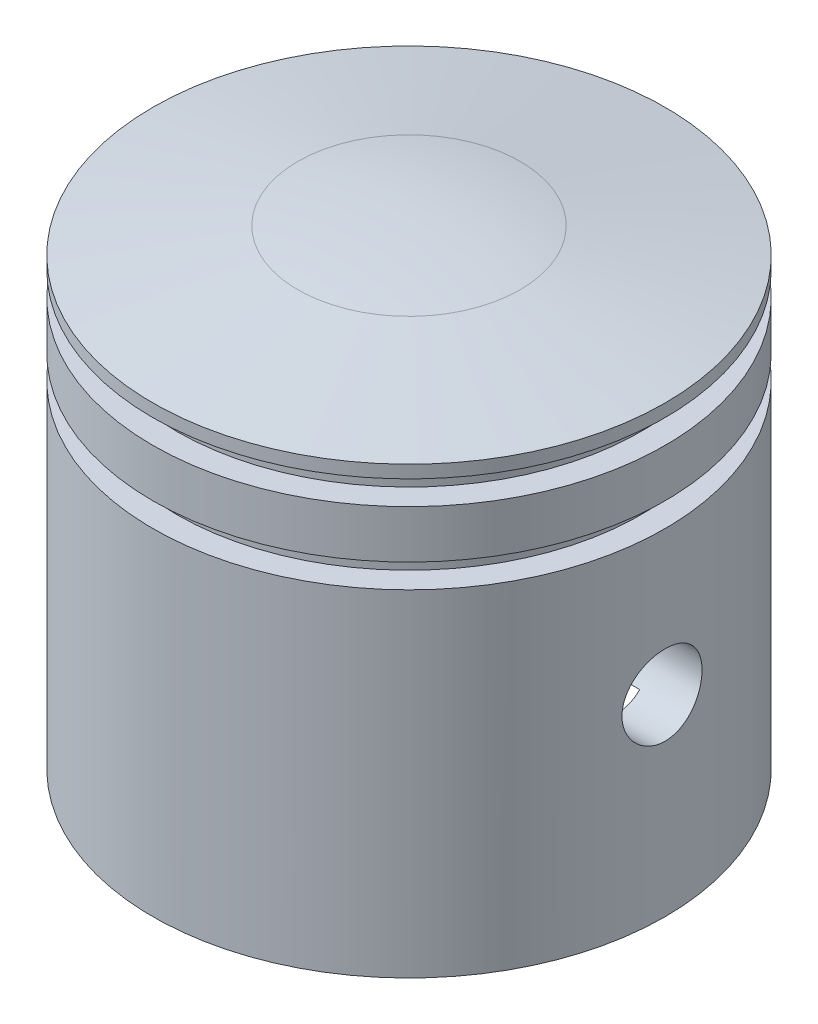
ISO-10303-21;
HEADER;
FILE_DESCRIPTION(('STEP AP214'),'2;1');
FILE_NAME('part.step','',(''),(''),'','','');
FILE_SCHEMA(('AUTOMOTIVE_DESIGN { 1 0 10303 214 1 1 1 1 }'));
ENDSEC;
DATA;
#1=APPLICATION_CONTEXT('core data for automotive mechanical design processes');
#2=APPLICATION_PROTOCOL_DEFINITION('international standard','automotive_design',2000,#1);
#3=PRODUCT_CONTEXT('',#1,'mechanical');
#4=PRODUCT('Part','Part','',(#3));
#5=PRODUCT_RELATED_PRODUCT_CATEGORY('part','',(#4));
#6=PRODUCT_DEFINITION_FORMATION('','',#4);
#7=PRODUCT_DEFINITION_CONTEXT('part definition',#1,'design');
#8=PRODUCT_DEFINITION('design','',#6,#7);
#9=PRODUCT_DEFINITION_SHAPE('','',#8);
#10=(LENGTH_UNIT() NAMED_UNIT(*) SI_UNIT(.MILLI.,.METRE.));
#11=(NAMED_UNIT(*) PLANE_ANGLE_UNIT() SI_UNIT($,.RADIAN.));
#12=(NAMED_UNIT(*) SI_UNIT($,.STERADIAN.) SOLID_ANGLE_UNIT());
#13=UNCERTAINTY_MEASURE_WITH_UNIT(LENGTH_MEASURE(1.E-05),#10,'distance_accuracy_value','');
#14=(GEOMETRIC_REPRESENTATION_CONTEXT(3) GLOBAL_UNCERTAINTY_ASSIGNED_CONTEXT((#13)) GLOBAL_UNIT_ASSIGNED_CONTEXT((#10,
#11,#12)) REPRESENTATION_CONTEXT('',''));
#15=CARTESIAN_POINT('',(0.,0.,0.));
#16=DIRECTION('',(0.,0.,1.));
#17=DIRECTION('',(1.,0.,0.));
#18=AXIS2_PLACEMENT_3D('',#15,#16,#17);
#19=CARTESIAN_POINT('',(0.,10.,0.));
#20=DIRECTION('',(0.,-1.,0.));
#21=DIRECTION('',(1.,0.,0.));
#22=AXIS2_PLACEMENT_3D('',#19,#20,#21);
#23=PLANE('',#22);
#24=DIRECTION('',(1.,0.,0.));
#25=VECTOR('',#24,1.);
#26=CARTESIAN_POINT('',(-16.,10.,-1.5));
#27=LINE('',#26,#25);
#28=CARTESIAN_POINT('',(-12.913171570145,10.,-1.5));
#29=VERTEX_POINT('',#28);
#30=CARTESIAN_POINT('',(-9.88685996664259,10.,-1.5));
#31=VERTEX_POINT('',#30);
#32=EDGE_CURVE('E74',#29,#31,#27,.T.);
#33=ORIENTED_EDGE('',*,*,#32,.F.);
#34=CARTESIAN_POINT('',(0.,10.,0.));
#35=DIRECTION('',(0.,-1.,0.));
#36=DIRECTION('',(1.,0.,0.));
#37=AXIS2_PLACEMENT_3D('',#34,#35,#36);
#38=CIRCLE('',#37,13.);
#39=CARTESIAN_POINT('',(12.913171570145,10.,-1.5));
#40=VERTEX_POINT('',#39);
#41=EDGE_CURVE('E116',#29,#40,#38,.T.);
#42=ORIENTED_EDGE('',*,*,#41,.T.);
#43=CARTESIAN_POINT('',(9.88685996664259,10.,-1.5));
#44=VERTEX_POINT('',#43);
#45=EDGE_CURVE('E289',#44,#40,#27,.T.);
#46=ORIENTED_EDGE('',*,*,#45,.F.);
#47=CARTESIAN_POINT('',(0.,10.,0.));
#48=DIRECTION('',(0.,-1.,0.));
#49=DIRECTION('',(1.,0.,0.));
#50=AXIS2_PLACEMENT_3D('',#47,#48,#49);
#51=CIRCLE('',#50,10.);
#52=EDGE_CURVE('E111',#44,#31,#51,.F.);
#53=ORIENTED_EDGE('',*,*,#52,.T.);
#54=EDGE_LOOP('',(#33,#42,#46,#53));
#55=FACE_BOUND('',#54,.T.);
#56=ADVANCED_FACE('F45',(#55),#23,.T.);
#57=CARTESIAN_POINT('',(0.,30.,0.));
#58=DIRECTION('',(0.,1.,0.));
#59=DIRECTION('',(-1.,0.,0.));
#60=AXIS2_PLACEMENT_3D('',#57,#58,#59);
#61=CYLINDRICAL_SURFACE('',#60,16.);
#62=CARTESIAN_POINT('',(0.,27.,0.));
#63=DIRECTION('',(0.,1.,0.));
#64=DIRECTION('',(0.,0.,1.));
#65=AXIS2_PLACEMENT_3D('',#62,#63,#64);
#66=CIRCLE('',#65,16.);
#67=CARTESIAN_POINT('',(0.,27.,16.));
#68=VERTEX_POINT('',#67);
#69=EDGE_CURVE('E243',#68,#68,#66,.T.);
#70=ORIENTED_EDGE('',*,*,#69,.T.);
#71=EDGE_LOOP('',(#70));
#72=FACE_BOUND('',#71,.T.);
#73=CARTESIAN_POINT('',(0.,27.7958327840944,0.));
#74=DIRECTION('',(0.,1.,0.));
#75=DIRECTION('',(-1.,0.,0.));
#76=AXIS2_PLACEMENT_3D('',#73,#74,#75);
#77=CIRCLE('',#76,16.);
#78=CARTESIAN_POINT('',(-16.,27.7958327840944,0.));
#79=VERTEX_POINT('',#78);
#80=EDGE_CURVE('E257',#79,#79,#77,.T.);
#81=ORIENTED_EDGE('',*,*,#80,.F.);
#82=EDGE_LOOP('',(#81));
#83=FACE_BOUND('',#82,.T.);
#84=ADVANCED_FACE('F163',(#72,#83),#61,.T.);
#85=CARTESIAN_POINT('',(0.,27.7958327840944,0.));
#86=DIRECTION('',(0.,-1.,0.));
#87=DIRECTION('',(1.,0.,0.));
#88=AXIS2_PLACEMENT_3D('',#85,#86,#87);
#89=CONICAL_SURFACE('',#88,16.,1.39626340159547);
#90=CARTESIAN_POINT('',(0.,29.3923101204884,0.));
#91=DIRECTION('',(0.,1.,0.));
#92=DIRECTION('',(-1.,0.,0.));
#93=AXIS2_PLACEMENT_3D('',#90,#91,#92);
#94=CIRCLE('',#93,6.94592710667694);
#95=CARTESIAN_POINT('',(-6.94592710667694,29.3923101204884,0.));
#96=VERTEX_POINT('',#95);
#97=EDGE_CURVE('E254',#96,#96,#94,.T.);
#98=ORIENTED_EDGE('',*,*,#97,.F.);
#99=EDGE_LOOP('',(#98));
#100=FACE_BOUND('',#99,.T.);
#101=ORIENTED_EDGE('',*,*,#80,.T.);
#102=EDGE_LOOP('',(#101));
#103=FACE_BOUND('',#102,.T.);
#104=ADVANCED_FACE('F167',(#100,#103),#89,.T.);
#105=CARTESIAN_POINT('',(0.,-9.99999999999999,0.));
#106=DIRECTION('',(0.,1.,0.));
#107=DIRECTION('',(1.,0.,0.));
#108=AXIS2_PLACEMENT_3D('',#105,#106,#107);
#109=SPHERICAL_SURFACE('',#108,40.);
#110=ORIENTED_EDGE('',*,*,#97,.T.);
#111=EDGE_LOOP('',(#110));
#112=FACE_BOUND('',#111,.T.);
#113=ADVANCED_FACE('F174',(#112),#109,.T.);
#114=CARTESIAN_POINT('',(14.5,25.5,0.));
#115=DIRECTION('',(0.,-1.,0.));
#116=DIRECTION('',(0.,0.,-1.));
#117=AXIS2_PLACEMENT_3D('',#114,#115,#116);
#118=PLANE('',#117);
#119=CARTESIAN_POINT('',(0.,25.5,0.));
#120=DIRECTION('',(0.,-1.,0.));
#121=DIRECTION('',(0.,0.,-1.));
#122=AXIS2_PLACEMENT_3D('',#119,#120,#121);
#123=CIRCLE('',#122,14.5);
#124=CARTESIAN_POINT('',(0.,25.5,-14.5));
#125=VERTEX_POINT('',#124);
#126=EDGE_CURVE('E238',#125,#125,#123,.T.);
#127=ORIENTED_EDGE('',*,*,#126,.T.);
#128=EDGE_LOOP('',(#127));
#129=FACE_BOUND('',#128,.T.);
#130=CARTESIAN_POINT('',(0.,25.5,0.));
#131=DIRECTION('',(0.,-1.,0.));
#132=DIRECTION('',(0.,0.,-1.));
#133=AXIS2_PLACEMENT_3D('',#130,#131,#132);
#134=CIRCLE('',#133,16.);
#135=CARTESIAN_POINT('',(0.,25.5,-16.));
#136=VERTEX_POINT('',#135);
#137=EDGE_CURVE('E119',#136,#136,#134,.T.);
#138=ORIENTED_EDGE('',*,*,#137,.F.);
#139=EDGE_LOOP('',(#138));
#140=FACE_BOUND('',#139,.T.);
#141=ADVANCED_FACE('F178',(#129,#140),#118,.F.);
#142=CARTESIAN_POINT('',(14.5,27.,0.));
#143=DIRECTION('',(0.,1.,0.));
#144=DIRECTION('',(0.,0.,1.));
#145=AXIS2_PLACEMENT_3D('',#142,#143,#144);
#146=PLANE('',#145);
#147=CARTESIAN_POINT('',(0.,27.,0.));
#148=DIRECTION('',(0.,-1.,0.));
#149=DIRECTION('',(0.,0.,-1.));
#150=AXIS2_PLACEMENT_3D('',#147,#148,#149);
#151=CIRCLE('',#150,14.5);
#152=CARTESIAN_POINT('',(0.,27.,-14.5));
#153=VERTEX_POINT('',#152);
#154=EDGE_CURVE('E246',#153,#153,#151,.T.);
#155=ORIENTED_EDGE('',*,*,#154,.F.);
#156=EDGE_LOOP('',(#155));
#157=FACE_BOUND('',#156,.T.);
#158=ORIENTED_EDGE('',*,*,#69,.F.);
#159=EDGE_LOOP('',(#158));
#160=FACE_BOUND('',#159,.T.);
#161=ADVANCED_FACE('F195',(#157,#160),#146,.F.);
#162=CARTESIAN_POINT('',(0.,0.,0.));
#163=DIRECTION('',(0.,-1.,0.));
#164=DIRECTION('',(0.,0.,-1.));
#165=AXIS2_PLACEMENT_3D('',#162,#163,#164);
#166=CYLINDRICAL_SURFACE('',#165,14.5);
#167=ORIENTED_EDGE('',*,*,#126,.F.);
#168=EDGE_LOOP('',(#167));
#169=FACE_BOUND('',#168,.T.);
#170=ORIENTED_EDGE('',*,*,#154,.T.);
#171=EDGE_LOOP('',(#170));
#172=FACE_BOUND('',#171,.T.);
#173=ADVANCED_FACE('F192',(#169,#172),#166,.T.);
#174=ORIENTED_EDGE('',*,*,#137,.T.);
#175=EDGE_LOOP('',(#174));
#176=FACE_BOUND('',#175,.T.);
#177=CARTESIAN_POINT('',(0.,22.5,0.));
#178=DIRECTION('',(0.,1.,0.));
#179=DIRECTION('',(0.,0.,1.));
#180=AXIS2_PLACEMENT_3D('',#177,#178,#179);
#181=CIRCLE('',#180,16.);
#182=CARTESIAN_POINT('',(0.,22.5,16.));
#183=VERTEX_POINT('',#182);
#184=EDGE_CURVE('E234',#183,#183,#181,.T.);
#185=ORIENTED_EDGE('',*,*,#184,.T.);
#186=EDGE_LOOP('',(#185));
#187=FACE_BOUND('',#186,.T.);
#188=ADVANCED_FACE('F169',(#176,#187),#61,.T.);
#189=CARTESIAN_POINT('',(14.5,21.,0.));
#190=DIRECTION('',(0.,-1.,0.));
#191=DIRECTION('',(0.,0.,-1.));
#192=AXIS2_PLACEMENT_3D('',#189,#190,#191);
#193=PLANE('',#192);
#194=CARTESIAN_POINT('',(0.,21.,0.));
#195=DIRECTION('',(0.,-1.,0.));
#196=DIRECTION('',(0.,0.,-1.));
#197=AXIS2_PLACEMENT_3D('',#194,#195,#196);
#198=CIRCLE('',#197,14.5);
#199=CARTESIAN_POINT('',(0.,21.,-14.5));
#200=VERTEX_POINT('',#199);
#201=EDGE_CURVE('E263',#200,#200,#198,.T.);
#202=ORIENTED_EDGE('',*,*,#201,.T.);
#203=EDGE_LOOP('',(#202));
#204=FACE_BOUND('',#203,.T.);
#205=CARTESIAN_POINT('',(0.,21.,0.));
#206=DIRECTION('',(0.,-1.,0.));
#207=DIRECTION('',(0.,0.,-1.));
#208=AXIS2_PLACEMENT_3D('',#205,#206,#207);
#209=CIRCLE('',#208,16.);
#210=CARTESIAN_POINT('',(0.,21.,-16.));
#211=VERTEX_POINT('',#210);
#212=EDGE_CURVE('E237',#211,#211,#209,.T.);
#213=ORIENTED_EDGE('',*,*,#212,.F.);
#214=EDGE_LOOP('',(#213));
#215=FACE_BOUND('',#214,.T.);
#216=ADVANCED_FACE('F185',(#204,#215),#193,.F.);
#217=CARTESIAN_POINT('',(14.5,22.5,0.));
#218=DIRECTION('',(0.,1.,0.));
#219=DIRECTION('',(0.,0.,1.));
#220=AXIS2_PLACEMENT_3D('',#217,#218,#219);
#221=PLANE('',#220);
#222=CARTESIAN_POINT('',(0.,22.5,0.));
#223=DIRECTION('',(0.,-1.,0.));
#224=DIRECTION('',(0.,0.,-1.));
#225=AXIS2_PLACEMENT_3D('',#222,#223,#224);
#226=CIRCLE('',#225,14.5);
#227=CARTESIAN_POINT('',(0.,22.5,-14.5));
#228=VERTEX_POINT('',#227);
#229=EDGE_CURVE('E267',#228,#228,#226,.T.);
#230=ORIENTED_EDGE('',*,*,#229,.F.);
#231=EDGE_LOOP('',(#230));
#232=FACE_BOUND('',#231,.T.);
#233=ORIENTED_EDGE('',*,*,#184,.F.);
#234=EDGE_LOOP('',(#233));
#235=FACE_BOUND('',#234,.T.);
#236=ADVANCED_FACE('F183',(#232,#235),#221,.F.);
#237=CARTESIAN_POINT('',(0.,0.,0.));
#238=DIRECTION('',(0.,-1.,0.));
#239=DIRECTION('',(0.,0.,-1.));
#240=AXIS2_PLACEMENT_3D('',#237,#238,#239);
#241=CYLINDRICAL_SURFACE('',#240,14.5);
#242=ORIENTED_EDGE('',*,*,#201,.F.);
#243=EDGE_LOOP('',(#242));
#244=FACE_BOUND('',#243,.T.);
#245=ORIENTED_EDGE('',*,*,#229,.T.);
#246=EDGE_LOOP('',(#245));
#247=FACE_BOUND('',#246,.T.);
#248=ADVANCED_FACE('F180',(#244,#247),#241,.T.);
#249=CARTESIAN_POINT('',(0.,0.,0.));
#250=DIRECTION('',(0.,1.,0.));
#251=DIRECTION('',(-1.,0.,0.));
#252=AXIS2_PLACEMENT_3D('',#249,#250,#251);
#253=PLANE('',#252);
#254=CARTESIAN_POINT('',(0.,0.,0.));
#255=DIRECTION('',(0.,-1.,0.));
#256=DIRECTION('',(1.,0.,0.));
#257=AXIS2_PLACEMENT_3D('',#254,#255,#256);
#258=CIRCLE('',#257,13.);
#259=CARTESIAN_POINT('',(13.,0.,0.));
#260=VERTEX_POINT('',#259);
#261=EDGE_CURVE('E277',#260,#260,#258,.T.);
#262=ORIENTED_EDGE('',*,*,#261,.F.);
#263=EDGE_LOOP('',(#262));
#264=FACE_BOUND('',#263,.T.);
#265=CARTESIAN_POINT('',(0.,0.,0.));
#266=DIRECTION('',(0.,1.,0.));
#267=DIRECTION('',(-1.,0.,0.));
#268=AXIS2_PLACEMENT_3D('',#265,#266,#267);
#269=CIRCLE('',#268,16.);
#270=CARTESIAN_POINT('',(-16.,0.,0.));
#271=VERTEX_POINT('',#270);
#272=EDGE_CURVE('E99',#271,#271,#269,.T.);
#273=ORIENTED_EDGE('',*,*,#272,.F.);
#274=EDGE_LOOP('',(#273));
#275=FACE_BOUND('',#274,.T.);
#276=ADVANCED_FACE('F47',(#264,#275),#253,.F.);
#277=CARTESIAN_POINT('',(-16.,9.5,0.));
#278=CARTESIAN_POINT('',(-15.9999977019448,9.50000569827152,-0.139515097271033));
#279=CARTESIAN_POINT('',(-15.9981561248574,9.51171811377356,-0.279109404865704));
#280=CARTESIAN_POINT('',(-15.9909869809759,9.55824369127675,-0.554391314978102));
#281=CARTESIAN_POINT('',(-15.9856560884472,9.59307889250351,-0.690075061323317));
#282=CARTESIAN_POINT('',(-15.9721069716578,9.68477966280662,-0.953512538047404));
#283=CARTESIAN_POINT('',(-15.9638909956317,9.7416280813616,-1.0812723522899));
#284=CARTESIAN_POINT('',(-15.9454779403816,9.87569854514161,-1.3254212510446));
#285=CARTESIAN_POINT('',(-15.9352811186255,9.95291794303594,-1.44181181036831));
#286=CARTESIAN_POINT('',(-15.9139426841436,10.126233048354,-1.66091991165162));
#287=CARTESIAN_POINT('',(-15.9027945139234,10.2224669948902,-1.76352747914264));
#288=CARTESIAN_POINT('',(-15.8808607613029,10.4307819482689,-1.95120768822823));
#289=CARTESIAN_POINT('',(-15.8700752005075,10.5428638973002,-2.03627928654192));
#290=CARTESIAN_POINT('',(-15.8500242812745,10.7804382713437,-2.18690544328884));
#291=CARTESIAN_POINT('',(-15.840767397861,10.9059994823618,-2.25235273557992));
#292=CARTESIAN_POINT('',(-15.8249120174237,11.1665014108578,-2.36118681597065));
#293=CARTESIAN_POINT('',(-15.8183133630222,11.3014415725106,-2.40457491010063));
#294=CARTESIAN_POINT('',(-15.8085863451104,11.5757109011438,-2.46771559322167));
#295=CARTESIAN_POINT('',(-15.8054302653236,11.7149955858188,-2.48765705487496));
#296=CARTESIAN_POINT('',(-15.8028617107177,11.9949671888926,-2.50392369757622));
#297=CARTESIAN_POINT('',(-15.8034490028802,12.135654019466,-2.50025034860466));
#298=CARTESIAN_POINT('',(-15.8082755045521,12.4130970318527,-2.4695458080889));
#299=CARTESIAN_POINT('',(-15.8124817218495,12.5498772233531,-2.44272562959693));
#300=CARTESIAN_POINT('',(-15.8240205634547,12.8169720063593,-2.36681937833752));
#301=CARTESIAN_POINT('',(-15.8313532830641,12.9472864006405,-2.31773262684132));
#302=CARTESIAN_POINT('',(-15.8483550685462,13.1983887126772,-2.19846916949384));
#303=CARTESIAN_POINT('',(-15.8580339308724,13.3191337917731,-2.12820372315549));
#304=CARTESIAN_POINT('',(-15.878630461501,13.5471995356855,-1.96864058146637));
#305=CARTESIAN_POINT('',(-15.8895482178821,13.6545192448875,-1.87934153253017));
#306=CARTESIAN_POINT('',(-15.911537862489,13.8539102466333,-1.68309088822333));
#307=CARTESIAN_POINT('',(-15.9226101363559,13.9458031582695,-1.57595800560539));
#308=CARTESIAN_POINT('',(-15.9435512534783,14.1103331456399,-1.34769694737936));
#309=CARTESIAN_POINT('',(-15.9534200906202,14.1829701235568,-1.22656870068132));
#310=CARTESIAN_POINT('',(-15.9708539902704,14.3069380734224,-0.973595927056491));
#311=CARTESIAN_POINT('',(-15.9784174854193,14.358254558533,-0.84174418624046));
#312=CARTESIAN_POINT('',(-15.9903756000068,14.4379659674472,-0.571149534696759));
#313=CARTESIAN_POINT('',(-15.9947704520898,14.4663625740665,-0.4324071306872));
#314=CARTESIAN_POINT('',(-15.9998651172728,14.4991892764502,-0.153508336763735));
#315=CARTESIAN_POINT('',(-16.0006027179286,14.5038644789762,-0.0133814615087023));
#316=CARTESIAN_POINT('',(-15.9984028649127,14.489767294664,0.265654546411642));
#317=CARTESIAN_POINT('',(-15.9954655349964,14.4709956974109,0.404563719925156));
#318=CARTESIAN_POINT('',(-15.9862692369322,14.4107416123198,0.676473446265704));
#319=CARTESIAN_POINT('',(-15.9800278421539,14.3693792417323,0.809501262056042));
#320=CARTESIAN_POINT('',(-15.9649207568356,14.2652449056012,1.06673406785663));
#321=CARTESIAN_POINT('',(-15.9560549341007,14.2024718615573,1.19093861303941));
#322=CARTESIAN_POINT('',(-15.9365897274094,14.0567280088734,1.42807220225041));
#323=CARTESIAN_POINT('',(-15.9259772866342,13.9736025799095,1.54090512378372));
#324=CARTESIAN_POINT('',(-15.9042388046444,13.7897279140922,1.75110696507806));
#325=CARTESIAN_POINT('',(-15.8931127309268,13.6889775607952,1.84847490447018));
#326=CARTESIAN_POINT('',(-15.8714802753665,13.4716188027828,2.02588080776691));
#327=CARTESIAN_POINT('',(-15.860980411908,13.3548751528777,2.10575398584126));
#328=CARTESIAN_POINT('',(-15.8419069280583,13.1094839263387,2.2447556772664));
#329=CARTESIAN_POINT('',(-15.83333325222,12.9808366925105,2.30388478778105));
#330=CARTESIAN_POINT('',(-15.8191307135236,12.7157703592858,2.39946771944995));
#331=CARTESIAN_POINT('',(-15.8134908234896,12.5793825312344,2.43600654947912));
#332=CARTESIAN_POINT('',(-15.8057657028079,12.302310856336,2.48564122040535));
#333=CARTESIAN_POINT('',(-15.8036802038444,12.161627334581,2.49873883084997));
#334=CARTESIAN_POINT('',(-15.8033105804488,11.8816012840925,2.50107452690756));
#335=CARTESIAN_POINT('',(-15.804985160429,11.7422609030665,2.49057180548425));
#336=CARTESIAN_POINT('',(-15.8118569894183,11.4673547028557,2.44656223255901));
#337=CARTESIAN_POINT('',(-15.8170542307995,11.3317888754983,2.41305543086961));
#338=CARTESIAN_POINT('',(-15.8303708885491,11.0683621733595,2.32408329891852));
#339=CARTESIAN_POINT('',(-15.8384876895341,10.9404945217416,2.26863761738581));
#340=CARTESIAN_POINT('',(-15.856731840474,10.6958343863237,2.13738768546417));
#341=CARTESIAN_POINT('',(-15.8668592701083,10.5790423417116,2.06158262820886));
#342=CARTESIAN_POINT('',(-15.8881156809226,10.3585344558732,1.8908300813908));
#343=CARTESIAN_POINT('',(-15.8992540116029,10.2549678033862,1.79569107094768));
#344=CARTESIAN_POINT('',(-15.9212004364073,10.0651787636133,1.58937594638204));
#345=CARTESIAN_POINT('',(-15.9320084534012,9.97896040140812,1.47819612078433));
#346=CARTESIAN_POINT('',(-15.952151024567,9.82584877696844,1.24216685884342));
#347=CARTESIAN_POINT('',(-15.9614763443027,9.75907462724039,1.11723937214238));
#348=CARTESIAN_POINT('',(-15.9775125983888,9.64755900380706,0.857851882357786));
#349=CARTESIAN_POINT('',(-15.9842262014212,9.60279502744161,0.723401776581764));
#350=CARTESIAN_POINT('',(-15.9927744586488,9.54656697890941,0.490314239911595));
#351=CARTESIAN_POINT('',(-15.9954699162612,9.529131509371,0.393105575651625));
#352=CARTESIAN_POINT('',(-15.9990834869762,9.50584608662092,0.197277797850582));
#353=CARTESIAN_POINT('',(-16.0000016250796,9.49999597044266,0.0986587041691187));
#354=CARTESIAN_POINT('',(-16.,9.5,0.));
#355=B_SPLINE_CURVE_WITH_KNOTS('',3,(#277,#278,#279,#280,#281,#282,#283,#284,#285,#286,#287,
#288,#289,#290,#291,#292,#293,#294,#295,#296,#297,#298,#299,#300,#301,#302,#303,#304,#305,#306,
#307,#308,#309,#310,#311,#312,#313,#314,#315,#316,#317,#318,#319,#320,#321,#322,#323,#324,#325,
#326,#327,#328,#329,#330,#331,#332,#333,#334,#335,#336,#337,#338,#339,#340,#341,#342,#343,#344,
#345,#346,#347,#348,#349,#350,#351,#352,#353,#354),.UNSPECIFIED.,.T.,.F.,(4,2,2,2,2,2,2,2,2,2,2,
2,2,2,2,2,2,2,2,2,2,2,2,2,2,2,2,2,2,2,2,2,2,2,2,2,2,2,4),(0.,0.418184740477491,
0.836768642528014,1.25502707944103,1.6732311879203,2.09459568152199,2.51598523645422,
2.93963778605759,3.36326525009238,3.78345631134994,4.20362121670545,4.6199957602258,
5.03638299651051,5.45453977402348,5.87272629892068,6.29545732334367,6.71819049513827,
7.14121043754565,7.56419931829866,7.98280854005915,8.40140366528357,8.81779444756567,
9.23420620742031,9.65388541469672,10.0735912160142,10.4970948024959,10.9205861964898,
11.3424741039513,11.764330162293,12.1815758159869,12.598820566189,13.0156924696662,
13.4325808967135,13.8538201231554,14.275156971423,14.6990230419984,15.1224548565628,
15.4181801635154,15.7139013105871),.UNSPECIFIED.);
#356=CARTESIAN_POINT('',(-16.,9.5,0.));
#357=VERTEX_POINT('',#356);
#358=EDGE_CURVE('E159',#357,#357,#355,.T.);
#359=ORIENTED_EDGE('',*,*,#358,.T.);
#360=EDGE_LOOP('',(#359));
#361=FACE_BOUND('',#360,.T.);
#362=CARTESIAN_POINT('',(15.8034806292791,12.,-2.5));
#363=CARTESIAN_POINT('',(15.8034830346333,11.860496621659,-2.49999429179104));
#364=CARTESIAN_POINT('',(15.8053478026579,11.7209140023147,-2.48828377742084));
#365=CARTESIAN_POINT('',(15.8125997089632,11.4456563709971,-2.44176643645043));
#366=CARTESIAN_POINT('',(15.8179902148259,11.3099852245206,-2.40693752801736));
#367=CARTESIAN_POINT('',(15.8316684916184,11.0465744103556,-2.31525516047132));
#368=CARTESIAN_POINT('',(15.8399539668268,10.9188285521292,-2.25841914921922));
#369=CARTESIAN_POINT('',(15.8584858981599,10.6747031091579,-2.12437791816389));
#370=CARTESIAN_POINT('',(15.8687321022282,10.5583220663405,-2.04717531605122));
#371=CARTESIAN_POINT('',(15.8901303851737,10.3392035148487,-1.87387730110911));
#372=CARTESIAN_POINT('',(15.9012888784461,10.2365789256004,-1.777639886175));
#373=CARTESIAN_POINT('',(15.9231973082665,10.0488657795701,-1.56931080987672));
#374=CARTESIAN_POINT('',(15.9339472216983,9.96377821377571,-1.45721825316848));
#375=CARTESIAN_POINT('',(15.9538946715316,9.81313512295885,-1.21963429185761));
#376=CARTESIAN_POINT('',(15.9630838016344,9.74768399602554,-1.09407592635729));
#377=CARTESIAN_POINT('',(15.978803149105,9.63884204527492,-0.833580171794756));
#378=CARTESIAN_POINT('',(15.9853335186778,9.59544995861733,-0.698643320136811));
#379=CARTESIAN_POINT('',(15.9949542857973,9.53230128104384,-0.424385325448812));
#380=CARTESIAN_POINT('',(15.9980722260505,9.51235535093165,-0.285108760160752));
#381=CARTESIAN_POINT('',(16.0006113098095,9.49607695669663,-0.00515314355067114));
#382=CARTESIAN_POINT('',(16.0000326754547,9.49974307364815,0.135525822989186));
#383=CARTESIAN_POINT('',(15.9952657389869,9.53043592627786,0.413000089722151));
#384=CARTESIAN_POINT('',(15.9911089169598,9.55725893884032,0.549818542575174));
#385=CARTESIAN_POINT('',(15.9796877395528,9.63318402862262,0.816988375343491));
#386=CARTESIAN_POINT('',(15.9724232987387,9.68228671835413,0.947339577352174));
#387=CARTESIAN_POINT('',(15.9555491842028,9.80158365586005,1.19848742679247));
#388=CARTESIAN_POINT('',(15.9459300777042,9.87186300542795,1.31924299071837));
#389=CARTESIAN_POINT('',(15.9254174702046,10.0314560806292,1.54732385653213));
#390=CARTESIAN_POINT('',(15.9145238783282,10.120771163955,1.65464819959324));
#391=CARTESIAN_POINT('',(15.8925387825556,10.3170334870733,1.85402198520023));
#392=CARTESIAN_POINT('',(15.8814464071021,10.4241586663949,1.94589625613075));
#393=CARTESIAN_POINT('',(15.8604269384475,10.6523975646821,2.11039226047485));
#394=CARTESIAN_POINT('',(15.8504998536298,10.7735113842741,2.18301385538335));
#395=CARTESIAN_POINT('',(15.8329349281613,11.0264796281058,2.30697060635685));
#396=CARTESIAN_POINT('',(15.8252991458489,11.1583435750735,2.35828663884161));
#397=CARTESIAN_POINT('',(15.8132168990948,11.4289648487055,2.43799343127668));
#398=CARTESIAN_POINT('',(15.8087701897074,11.5677216450697,2.46638595195258));
#399=CARTESIAN_POINT('',(15.8036163696886,11.8466281032752,2.49919719237856));
#400=CARTESIAN_POINT('',(15.80287044806,11.9867478001948,2.50386473411271));
#401=CARTESIAN_POINT('',(15.8050994977182,12.2657676352979,2.48975479033184));
#402=CARTESIAN_POINT('',(15.8080743433524,12.4046678145059,2.47097809654328));
#403=CARTESIAN_POINT('',(15.8173740105186,12.6765278074665,2.41072412555896));
#404=CARTESIAN_POINT('',(15.8236803883335,12.8095159986396,2.36937178781979));
#405=CARTESIAN_POINT('',(15.8389172439685,13.0666739711039,2.26527072241932));
#406=CARTESIAN_POINT('',(15.8478478614411,13.190843282649,2.20252085602949));
#407=CARTESIAN_POINT('',(15.8674179220711,13.4279512816488,2.05681199170293));
#408=CARTESIAN_POINT('',(15.8780706945976,13.5407902289,1.97369251093471));
#409=CARTESIAN_POINT('',(15.8998450469621,13.7510069808482,1.78982593995283));
#410=CARTESIAN_POINT('',(15.9109666556111,13.848383833607,1.6890777652142));
#411=CARTESIAN_POINT('',(15.9325473887455,14.0258112706355,1.47171546765808));
#412=CARTESIAN_POINT('',(15.9429995842164,14.1056965764301,1.35496564158984));
#413=CARTESIAN_POINT('',(15.9619548934084,14.2447195199902,1.10955861029337));
#414=CARTESIAN_POINT('',(15.9704580640831,14.3038577640459,0.980901753162492));
#415=CARTESIAN_POINT('',(15.9845269767683,14.3994462752842,0.715839663778327));
#416=CARTESIAN_POINT('',(15.9901042225572,14.4359854974394,0.579467147617089));
#417=CARTESIAN_POINT('',(15.9977412978946,14.4856261326728,0.302427949770746));
#418=CARTESIAN_POINT('',(15.9998013804089,14.498729231356,0.161761577654431));
#419=CARTESIAN_POINT('',(16.0001691012796,14.5010818526552,-0.118272165188271));
#420=CARTESIAN_POINT('',(15.9985164403994,14.4905837446428,-0.257637428859786));
#421=CARTESIAN_POINT('',(15.9917247801431,14.4465746838196,-0.532594595464882));
#422=CARTESIAN_POINT('',(15.9865857947973,14.4130638236216,-0.668186513581641));
#423=CARTESIAN_POINT('',(15.9733964142131,14.3240727402876,-0.931668850429401));
#424=CARTESIAN_POINT('',(15.965348528289,14.2686114484191,-1.05956579651625));
#425=CARTESIAN_POINT('',(15.947223323121,14.137321161478,-1.30427807253219));
#426=CARTESIAN_POINT('',(15.9371459268214,14.0614913930258,-1.42109298145458));
#427=CARTESIAN_POINT('',(15.9159528222148,13.8907105567916,-1.64160219185804));
#428=CARTESIAN_POINT('',(15.9048276353277,13.795573685696,-1.745151694824));
#429=CARTESIAN_POINT('',(15.8828612878644,13.5892700426646,-1.93490712736947));
#430=CARTESIAN_POINT('',(15.8720201944801,13.4780995182753,-2.02110898563013));
#431=CARTESIAN_POINT('',(15.8517779742959,13.2420788957246,-2.17420151541622));
#432=CARTESIAN_POINT('',(15.842386091806,13.1171490413903,-2.24097044145097));
#433=CARTESIAN_POINT('',(15.8262143333515,12.85775678237,-2.35247565604314));
#434=CARTESIAN_POINT('',(15.8194317848938,12.7233042988834,-2.3972345005847));
#435=CARTESIAN_POINT('',(15.8107909670081,12.4902302603036,-2.45344906957713));
#436=CARTESIAN_POINT('',(15.8080643798014,12.3930384000151,-2.47087849275467));
#437=CARTESIAN_POINT('',(15.8044083737681,12.1972442189536,-2.49415589078729));
#438=CARTESIAN_POINT('',(15.8034789284691,12.0986419189782,-2.50000403623692));
#439=CARTESIAN_POINT('',(15.8034806292791,12.,-2.5));
#440=B_SPLINE_CURVE_WITH_KNOTS('',3,(#362,#363,#364,#365,#366,#367,#368,#369,#370,#371,#372,
#373,#374,#375,#376,#377,#378,#379,#380,#381,#382,#383,#384,#385,#386,#387,#388,#389,#390,#391,
#392,#393,#394,#395,#396,#397,#398,#399,#400,#401,#402,#403,#404,#405,#406,#407,#408,#409,#410,
#411,#412,#413,#414,#415,#416,#417,#418,#419,#420,#421,#422,#423,#424,#425,#426,#427,#428,#429,
#430,#431,#432,#433,#434,#435,#436,#437,#438,#439),.UNSPECIFIED.,.T.,.F.,(4,2,2,2,2,2,2,2,2,2,2,
2,2,2,2,2,2,2,2,2,2,2,2,2,2,2,2,2,2,2,2,2,2,2,2,2,2,2,4),(0.,0.418149527902241,
0.836699032574077,1.25491737645053,1.67308199345223,2.09449258051085,2.51592697424482,
2.93956378022295,3.36317633102573,3.78334397517517,4.20348637030326,4.61996979150785,
5.03646466334576,5.45465612930833,5.87287743207563,6.29556043395287,6.71824647655855,
7.14131110038651,7.56434322607052,7.98292940034458,8.40150143908463,8.81778013452042,
9.23408098683358,9.65377352836981,10.0734918986585,10.4970197199928,10.9205351635679,
11.3423727623224,11.7641800198745,12.18149834073,12.5988149821383,13.0157724881518,
13.432745828047,13.8539404040181,14.275233715164,14.6991122166338,15.1225554163993,
15.4182305458031,15.7139013198205),.UNSPECIFIED.);
#441=CARTESIAN_POINT('',(15.8034806292791,12.,-2.5));
#442=VERTEX_POINT('',#441);
#443=EDGE_CURVE('E153',#442,#442,#440,.T.);
#444=ORIENTED_EDGE('',*,*,#443,.T.);
#445=EDGE_LOOP('',(#444));
#446=FACE_BOUND('',#445,.T.);
#447=ORIENTED_EDGE('',*,*,#212,.T.);
#448=EDGE_LOOP('',(#447));
#449=FACE_BOUND('',#448,.T.);
#450=ORIENTED_EDGE('',*,*,#272,.T.);
#451=EDGE_LOOP('',(#450));
#452=FACE_BOUND('',#451,.T.);
#453=ADVANCED_FACE('F170',(#361,#446,#449,#452),#61,.T.);
#454=DIRECTION('',(1.,0.,0.));
#455=VECTOR('',#454,1.);
#456=CARTESIAN_POINT('',(-16.,10.,1.5));
#457=LINE('',#456,#455);
#458=CARTESIAN_POINT('',(12.913171570145,10.,1.5));
#459=VERTEX_POINT('',#458);
#460=CARTESIAN_POINT('',(9.88685996664259,10.,1.5));
#461=VERTEX_POINT('',#460);
#462=EDGE_CURVE('E67',#459,#461,#457,.F.);
#463=ORIENTED_EDGE('',*,*,#462,.F.);
#464=CARTESIAN_POINT('',(-12.913171570145,10.,1.5));
#465=VERTEX_POINT('',#464);
#466=EDGE_CURVE('E106',#459,#465,#38,.T.);
#467=ORIENTED_EDGE('',*,*,#466,.T.);
#468=CARTESIAN_POINT('',(-9.88685996664259,10.,1.5));
#469=VERTEX_POINT('',#468);
#470=EDGE_CURVE('E92',#469,#465,#457,.F.);
#471=ORIENTED_EDGE('',*,*,#470,.F.);
#472=EDGE_CURVE('E104',#469,#461,#51,.F.);
#473=ORIENTED_EDGE('',*,*,#472,.T.);
#474=EDGE_LOOP('',(#463,#467,#471,#473));
#475=FACE_BOUND('',#474,.T.);
#476=ADVANCED_FACE('F103',(#475),#23,.T.);
#477=CARTESIAN_POINT('',(0.,10.,0.));
#478=DIRECTION('',(0.,-1.,0.));
#479=DIRECTION('',(1.,0.,0.));
#480=AXIS2_PLACEMENT_3D('',#477,#478,#479);
#481=CYLINDRICAL_SURFACE('',#480,13.);
#482=ORIENTED_EDGE('',*,*,#41,.F.);
#483=CARTESIAN_POINT('',(-12.913171570145,10.,-1.5));
#484=CARTESIAN_POINT('',(-12.9196464939997,9.95820085358915,-1.44426579878659));
#485=CARTESIAN_POINT('',(-12.9259549192278,9.91874092086908,-1.38679796540747));
#486=CARTESIAN_POINT('',(-12.9380773902685,9.84473133764257,-1.26873073828123));
#487=CARTESIAN_POINT('',(-12.9438914163828,9.81018188274731,-1.20813121991303));
#488=CARTESIAN_POINT('',(-12.9603404608392,9.71430178140072,-1.02224257355282));
#489=CARTESIAN_POINT('',(-12.9699930765876,9.66067330241013,-0.892775127826519));
#490=CARTESIAN_POINT('',(-12.9855839172602,9.57571702553779,-0.626442746105629));
#491=CARTESIAN_POINT('',(-12.9915189085937,9.54440863841842,-0.489571482352222));
#492=CARTESIAN_POINT('',(-12.9990013032835,9.50512260914373,-0.212467802603065));
#493=CARTESIAN_POINT('',(-13.0005515461425,9.49712986799228,-0.072237621167813));
#494=CARTESIAN_POINT('',(-12.9991042541622,9.50466026890764,0.206029683769605));
#495=CARTESIAN_POINT('',(-12.996155887224,9.51992916830979,0.344074092382287));
#496=CARTESIAN_POINT('',(-12.986125153176,9.57304239783094,0.615650842540818));
#497=CARTESIAN_POINT('',(-12.9790411747057,9.61089552758196,0.749181403888348));
#498=CARTESIAN_POINT('',(-12.9627490398878,9.70119099514041,0.989738928879762));
#499=CARTESIAN_POINT('',(-12.9539797808047,9.75083257474323,1.09785208331175));
#500=CARTESIAN_POINT('',(-12.9395107443663,9.83627154609569,1.25371177293856));
#501=CARTESIAN_POINT('',(-12.9344702910731,9.86656964555138,1.30459866498264));
#502=CARTESIAN_POINT('',(-12.9240502172861,9.9306832908871,1.4040757561164));
#503=CARTESIAN_POINT('',(-12.9186705698196,9.96449911663509,1.45266577202019));
#504=CARTESIAN_POINT('',(-12.913171570145,10.,1.5));
#505=B_SPLINE_CURVE_WITH_KNOTS('',3,(#483,#484,#485,#486,#487,#488,#489,#490,#491,#492,#493,
#494,#495,#496,#497,#498,#499,#500,#501,#502,#503,#504),.UNSPECIFIED.,.F.,.F.,(4,2,2,2,2,2,2,2,
2,2,4),(0.,0.209776062140148,0.419560478466375,0.838801230764256,1.25840613426738,
1.67773924513586,2.09252194041192,2.50746635565219,2.86404950501363,3.04223164009906,
3.22042796209395),.UNSPECIFIED.);
#506=EDGE_CURVE('E140',#29,#465,#505,.T.);
#507=ORIENTED_EDGE('',*,*,#506,.T.);
#508=ORIENTED_EDGE('',*,*,#466,.F.);
#509=CARTESIAN_POINT('',(12.913171570145,10.,1.5));
#510=CARTESIAN_POINT('',(12.9196464939997,9.95820085358915,1.44426579878659));
#511=CARTESIAN_POINT('',(12.9259549192278,9.91874092086908,1.38679796540747));
#512=CARTESIAN_POINT('',(12.9380773902685,9.84473133764257,1.26873073828123));
#513=CARTESIAN_POINT('',(12.9438914163828,9.81018188274731,1.20813121991303));
#514=CARTESIAN_POINT('',(12.9603404608392,9.71430178140072,1.02224257355282));
#515=CARTESIAN_POINT('',(12.9699930765876,9.66067330241013,0.892775127826519));
#516=CARTESIAN_POINT('',(12.9855839172602,9.57571702553779,0.626442746105629));
#517=CARTESIAN_POINT('',(12.9915189085937,9.54440863841842,0.489571482352222));
#518=CARTESIAN_POINT('',(12.9990013032835,9.50512260914373,0.212467802603065));
#519=CARTESIAN_POINT('',(13.0005515461425,9.49712986799228,0.072237621167813));
#520=CARTESIAN_POINT('',(12.9991042541622,9.50466026890764,-0.206029683769605));
#521=CARTESIAN_POINT('',(12.996155887224,9.51992916830979,-0.344074092382287));
#522=CARTESIAN_POINT('',(12.986125153176,9.57304239783094,-0.615650842540818));
#523=CARTESIAN_POINT('',(12.9790411747057,9.61089552758196,-0.749181403888348));
#524=CARTESIAN_POINT('',(12.9627490398878,9.70119099514041,-0.989738928879762));
#525=CARTESIAN_POINT('',(12.9539797808047,9.75083257474323,-1.09785208331175));
#526=CARTESIAN_POINT('',(12.9395107443663,9.83627154609569,-1.25371177293856));
#527=CARTESIAN_POINT('',(12.9344702910731,9.86656964555138,-1.30459866498264));
#528=CARTESIAN_POINT('',(12.9240502172861,9.9306832908871,-1.4040757561164));
#529=CARTESIAN_POINT('',(12.9186705698196,9.96449911663509,-1.45266577202019));
#530=CARTESIAN_POINT('',(12.913171570145,10.,-1.5));
#531=B_SPLINE_CURVE_WITH_KNOTS('',3,(#509,#510,#511,#512,#513,#514,#515,#516,#517,#518,#519,
#520,#521,#522,#523,#524,#525,#526,#527,#528,#529,#530),.UNSPECIFIED.,.F.,.F.,(4,2,2,2,2,2,2,2,
2,2,4),(0.,0.209776062140148,0.419560478466375,0.838801230764256,1.25840613426738,
1.67773924513586,2.09252194041192,2.50746635565219,2.86404950501363,3.04223164009906,
3.22042796209395),.UNSPECIFIED.);
#532=EDGE_CURVE('E147',#459,#40,#531,.T.);
#533=ORIENTED_EDGE('',*,*,#532,.T.);
#534=EDGE_LOOP('',(#482,#507,#508,#533));
#535=FACE_BOUND('',#534,.T.);
#536=ORIENTED_EDGE('',*,*,#261,.T.);
#537=EDGE_LOOP('',(#536));
#538=FACE_BOUND('',#537,.T.);
#539=ADVANCED_FACE('F211',(#535,#538),#481,.F.);
#540=CARTESIAN_POINT('',(0.,24.,0.));
#541=DIRECTION('',(0.,-1.,0.));
#542=DIRECTION('',(1.,0.,0.));
#543=AXIS2_PLACEMENT_3D('',#540,#541,#542);
#544=PLANE('',#543);
#545=CARTESIAN_POINT('',(0.,24.,0.));
#546=DIRECTION('',(0.,-1.,0.));
#547=DIRECTION('',(1.,0.,0.));
#548=AXIS2_PLACEMENT_3D('',#545,#546,#547);
#549=CIRCLE('',#548,10.);
#550=CARTESIAN_POINT('',(10.,24.,0.));
#551=VERTEX_POINT('',#550);
#552=EDGE_CURVE('E115',#551,#551,#549,.T.);
#553=ORIENTED_EDGE('',*,*,#552,.T.);
#554=EDGE_LOOP('',(#553));
#555=FACE_BOUND('',#554,.T.);
#556=ADVANCED_FACE('F215',(#555),#544,.T.);
#557=CARTESIAN_POINT('',(0.,24.,0.));
#558=DIRECTION('',(0.,-1.,0.));
#559=DIRECTION('',(1.,0.,0.));
#560=AXIS2_PLACEMENT_3D('',#557,#558,#559);
#561=CYLINDRICAL_SURFACE('',#560,10.);
#562=ORIENTED_EDGE('',*,*,#552,.F.);
#563=EDGE_LOOP('',(#562));
#564=FACE_BOUND('',#563,.T.);
#565=ORIENTED_EDGE('',*,*,#52,.F.);
#566=CARTESIAN_POINT('',(9.88685996664259,10.,-1.5));
#567=CARTESIAN_POINT('',(9.87829702632978,10.0423381044855,-1.55644775774642));
#568=CARTESIAN_POINT('',(9.8695164098382,10.0870272455987,-1.61105469283506));
#569=CARTESIAN_POINT('',(9.85176215376839,10.1808382203519,-1.71628235343695));
#570=CARTESIAN_POINT('',(9.84278851814074,10.2299599633339,-1.76690316043694));
#571=CARTESIAN_POINT('',(9.8159502550057,10.3835199248386,-1.91228287155091));
#572=CARTESIAN_POINT('',(9.79815893076328,10.4941971430423,-2.00061796766923));
#573=CARTESIAN_POINT('',(9.76481433608198,10.7291280421412,-2.15751587055995));
#574=CARTESIAN_POINT('',(9.74926267017561,10.8533913453404,-2.22606453693198));
#575=CARTESIAN_POINT('',(9.72224025261607,11.1120506879739,-2.3412731896829));
#576=CARTESIAN_POINT('',(9.7107671007491,11.246440711182,-2.38794605518357));
#577=CARTESIAN_POINT('',(9.6934351616116,11.5194319951237,-2.45735418339059));
#578=CARTESIAN_POINT('',(9.6874935617474,11.6579379985205,-2.48044304897375));
#579=CARTESIAN_POINT('',(9.68165898643259,11.937005984586,-2.50312290551809));
#580=CARTESIAN_POINT('',(9.68176622057743,12.0775680383293,-2.50271308223672));
#581=CARTESIAN_POINT('',(9.68793593914431,12.3529816746888,-2.47871632829885));
#582=CARTESIAN_POINT('',(9.69384866853871,12.4878879868879,-2.45571222118534));
#583=CARTESIAN_POINT('',(9.71071117534564,12.7518469398539,-2.38815579017542));
#584=CARTESIAN_POINT('',(9.72166092471398,12.8808996132072,-2.34360358625042));
#585=CARTESIAN_POINT('',(9.74746560596719,13.1307885670213,-2.23385335557449));
#586=CARTESIAN_POINT('',(9.7623529195144,13.2515457436194,-2.16848317197037));
#587=CARTESIAN_POINT('',(9.79434578612789,13.4805714327983,-2.01906213967446));
#588=CARTESIAN_POINT('',(9.81145177041249,13.5888375098736,-1.93500765725064));
#589=CARTESIAN_POINT('',(9.84655716119831,13.7930738176455,-1.74774822886378));
#590=CARTESIAN_POINT('',(9.86456812118589,13.8886024628581,-1.64406327335133));
#591=CARTESIAN_POINT('',(9.89902179366731,14.0610160403167,-1.42196244073076));
#592=CARTESIAN_POINT('',(9.91546444768792,14.1379002775831,-1.30354601474861));
#593=CARTESIAN_POINT('',(9.94504061645413,14.2711428922548,-1.05449104713443));
#594=CARTESIAN_POINT('',(9.95815689068242,14.3273949788563,-0.923793454785754));
#595=CARTESIAN_POINT('',(9.97947886085677,14.4170037555349,-0.654395587270723));
#596=CARTESIAN_POINT('',(9.98768547304251,14.4503647177176,-0.515696810583524));
#597=CARTESIAN_POINT('',(9.99811008554861,14.492511399187,-0.237953144489438));
#598=CARTESIAN_POINT('',(10.000472783337,14.5018911060145,-0.099003739975035));
#599=CARTESIAN_POINT('',(9.99936924845989,14.4974769837093,0.178494017362686));
#600=CARTESIAN_POINT('',(9.9959035931882,14.4836854500677,0.317042408550895));
#601=CARTESIAN_POINT('',(9.98363158834437,14.4338166174374,0.587489627768108));
#602=CARTESIAN_POINT('',(9.97491213094045,14.398101730266,0.719459604109865));
#603=CARTESIAN_POINT('',(9.95313476079063,14.3058384175761,0.975517412390962));
#604=CARTESIAN_POINT('',(9.94007644385454,14.2492880510571,1.09960450871051));
#605=CARTESIAN_POINT('',(9.91073923754746,14.1159019692027,1.33865740980875));
#606=CARTESIAN_POINT('',(9.89441061986185,14.0387459906073,1.45343824787646));
#607=CARTESIAN_POINT('',(9.86040263626624,13.8667177176332,1.66863689951077));
#608=CARTESIAN_POINT('',(9.84272302915515,13.7718422552908,1.76905213905724));
#609=CARTESIAN_POINT('',(9.80745084022131,13.5642240624884,1.95528314890228));
#610=CARTESIAN_POINT('',(9.78987165809029,13.4510916023801,2.04066765914235));
#611=CARTESIAN_POINT('',(9.75727211093037,13.2117695504121,2.19125512858105));
#612=CARTESIAN_POINT('',(9.7422516273326,13.0855805640214,2.25645902305417));
#613=CARTESIAN_POINT('',(9.71660606378031,12.8241689441377,2.36445617235024));
#614=CARTESIAN_POINT('',(9.70596195913239,12.6889884439287,2.40734664724386));
#615=CARTESIAN_POINT('',(9.690285382318,12.4130147047863,2.4697005191477));
#616=CARTESIAN_POINT('',(9.68525196910656,12.272222411187,2.48916784481465));
#617=CARTESIAN_POINT('',(9.681485324806,11.993351206597,2.50377586091762));
#618=CARTESIAN_POINT('',(9.68257592473742,11.855309944987,2.49959675920337));
#619=CARTESIAN_POINT('',(9.69051463097382,11.5819844112358,2.46863857730251));
#620=CARTESIAN_POINT('',(9.69736172755085,11.4466996598465,2.44186346060474));
#621=CARTESIAN_POINT('',(9.7159273203141,11.1837046528562,2.36690028143319));
#622=CARTESIAN_POINT('',(9.7276078655847,11.0559440558689,2.31887884039046));
#623=CARTESIAN_POINT('',(9.75452243524015,10.8101859662753,2.20291272179486));
#624=CARTESIAN_POINT('',(9.76975797816177,10.692192675089,2.13495952708639));
#625=CARTESIAN_POINT('',(9.80205872758479,10.4694963184945,1.98134844584284));
#626=CARTESIAN_POINT('',(9.81911397671681,10.3647271454983,1.89578474961086));
#627=CARTESIAN_POINT('',(9.8447745214587,10.2190217365953,1.755753626632));
#628=CARTESIAN_POINT('',(9.85334316782526,10.172350926578,1.70711514965063));
#629=CARTESIAN_POINT('',(9.870294132368,10.0830705460944,1.60621122310691));
#630=CARTESIAN_POINT('',(9.87867644573856,10.0404610802791,1.55394568014381));
#631=CARTESIAN_POINT('',(9.88685996664259,10.,1.5));
#632=B_SPLINE_CURVE_WITH_KNOTS('',3,(#566,#567,#568,#569,#570,#571,#572,#573,#574,#575,#576,
#577,#578,#579,#580,#581,#582,#583,#584,#585,#586,#587,#588,#589,#590,#591,#592,#593,#594,#595,
#596,#597,#598,#599,#600,#601,#602,#603,#604,#605,#606,#607,#608,#609,#610,#611,#612,#613,#614,
#615,#616,#617,#618,#619,#620,#621,#622,#623,#624,#625,#626,#627,#628,#629,#630,#631),
.UNSPECIFIED.,.F.,.F.,(4,2,2,2,2,2,2,2,2,2,2,2,2,2,2,2,2,2,2,2,2,2,2,2,2,2,2,2,2,2,2,2,4),(0.,
0.213103721326466,0.426203085131624,0.852181800832105,1.27846419335663,1.70449530088862,
2.12404062076728,2.5436004781318,2.95261455314388,3.36162635095094,3.77411240988667,
4.18667875961763,4.61107499679724,5.03548705112688,5.46205582242953,5.88854496274304,
6.30436336451695,6.72014057509215,7.12922311238162,7.53834376879667,7.95423603916423,
8.37020273579978,8.79664302749641,9.22306355277567,9.64761025686135,10.072085743757,
10.4844141078325,10.8966701618447,11.3057489306138,11.7150027605523,12.1221220591718,
12.3257851941602,12.5294535756357),.UNSPECIFIED.);
#633=EDGE_CURVE('E11',#44,#461,#632,.T.);
#634=ORIENTED_EDGE('',*,*,#633,.T.);
#635=ORIENTED_EDGE('',*,*,#472,.F.);
#636=CARTESIAN_POINT('',(-9.88685996664259,10.,1.5));
#637=CARTESIAN_POINT('',(-9.87829702632978,10.0423381044855,1.55644775774642));
#638=CARTESIAN_POINT('',(-9.8695164098382,10.0870272455987,1.61105469283506));
#639=CARTESIAN_POINT('',(-9.85176215376839,10.1808382203519,1.71628235343695));
#640=CARTESIAN_POINT('',(-9.84278851814074,10.2299599633339,1.76690316043694));
#641=CARTESIAN_POINT('',(-9.8159502550057,10.3835199248386,1.91228287155091));
#642=CARTESIAN_POINT('',(-9.79815893076328,10.4941971430423,2.00061796766923));
#643=CARTESIAN_POINT('',(-9.76481433608198,10.7291280421412,2.15751587055995));
#644=CARTESIAN_POINT('',(-9.74926267017561,10.8533913453404,2.22606453693198));
#645=CARTESIAN_POINT('',(-9.72224025261607,11.1120506879739,2.3412731896829));
#646=CARTESIAN_POINT('',(-9.7107671007491,11.246440711182,2.38794605518357));
#647=CARTESIAN_POINT('',(-9.6934351616116,11.5194319951237,2.45735418339059));
#648=CARTESIAN_POINT('',(-9.6874935617474,11.6579379985205,2.48044304897375));
#649=CARTESIAN_POINT('',(-9.68165898643259,11.937005984586,2.50312290551809));
#650=CARTESIAN_POINT('',(-9.68176622057743,12.0775680383293,2.50271308223672));
#651=CARTESIAN_POINT('',(-9.68793593914431,12.3529816746888,2.47871632829885));
#652=CARTESIAN_POINT('',(-9.69384866853871,12.4878879868879,2.45571222118534));
#653=CARTESIAN_POINT('',(-9.71071117534564,12.7518469398539,2.38815579017542));
#654=CARTESIAN_POINT('',(-9.72166092471398,12.8808996132072,2.34360358625042));
#655=CARTESIAN_POINT('',(-9.74746560596719,13.1307885670213,2.23385335557449));
#656=CARTESIAN_POINT('',(-9.7623529195144,13.2515457436194,2.16848317197037));
#657=CARTESIAN_POINT('',(-9.79434578612789,13.4805714327983,2.01906213967446));
#658=CARTESIAN_POINT('',(-9.81145177041249,13.5888375098736,1.93500765725064));
#659=CARTESIAN_POINT('',(-9.84655716119831,13.7930738176455,1.74774822886378));
#660=CARTESIAN_POINT('',(-9.86456812118589,13.8886024628581,1.64406327335133));
#661=CARTESIAN_POINT('',(-9.89902179366731,14.0610160403167,1.42196244073076));
#662=CARTESIAN_POINT('',(-9.91546444768792,14.1379002775831,1.30354601474861));
#663=CARTESIAN_POINT('',(-9.94504061645413,14.2711428922548,1.05449104713443));
#664=CARTESIAN_POINT('',(-9.95815689068242,14.3273949788563,0.923793454785754));
#665=CARTESIAN_POINT('',(-9.97947886085677,14.4170037555349,0.654395587270723));
#666=CARTESIAN_POINT('',(-9.98768547304251,14.4503647177176,0.515696810583524));
#667=CARTESIAN_POINT('',(-9.99811008554861,14.492511399187,0.237953144489438));
#668=CARTESIAN_POINT('',(-10.000472783337,14.5018911060145,0.099003739975035));
#669=CARTESIAN_POINT('',(-9.99936924845989,14.4974769837093,-0.178494017362686));
#670=CARTESIAN_POINT('',(-9.9959035931882,14.4836854500677,-0.317042408550895));
#671=CARTESIAN_POINT('',(-9.98363158834437,14.4338166174374,-0.587489627768108));
#672=CARTESIAN_POINT('',(-9.97491213094045,14.398101730266,-0.719459604109865));
#673=CARTESIAN_POINT('',(-9.95313476079063,14.3058384175761,-0.975517412390962));
#674=CARTESIAN_POINT('',(-9.94007644385454,14.2492880510571,-1.09960450871051));
#675=CARTESIAN_POINT('',(-9.91073923754746,14.1159019692027,-1.33865740980875));
#676=CARTESIAN_POINT('',(-9.89441061986185,14.0387459906073,-1.45343824787646));
#677=CARTESIAN_POINT('',(-9.86040263626624,13.8667177176332,-1.66863689951077));
#678=CARTESIAN_POINT('',(-9.84272302915515,13.7718422552908,-1.76905213905724));
#679=CARTESIAN_POINT('',(-9.80745084022131,13.5642240624884,-1.95528314890228));
#680=CARTESIAN_POINT('',(-9.78987165809029,13.4510916023801,-2.04066765914235));
#681=CARTESIAN_POINT('',(-9.75727211093037,13.2117695504121,-2.19125512858105));
#682=CARTESIAN_POINT('',(-9.7422516273326,13.0855805640214,-2.25645902305417));
#683=CARTESIAN_POINT('',(-9.71660606378031,12.8241689441377,-2.36445617235024));
#684=CARTESIAN_POINT('',(-9.70596195913239,12.6889884439287,-2.40734664724386));
#685=CARTESIAN_POINT('',(-9.690285382318,12.4130147047863,-2.4697005191477));
#686=CARTESIAN_POINT('',(-9.68525196910656,12.272222411187,-2.48916784481465));
#687=CARTESIAN_POINT('',(-9.681485324806,11.993351206597,-2.50377586091762));
#688=CARTESIAN_POINT('',(-9.68257592473742,11.855309944987,-2.49959675920337));
#689=CARTESIAN_POINT('',(-9.69051463097382,11.5819844112358,-2.46863857730251));
#690=CARTESIAN_POINT('',(-9.69736172755085,11.4466996598465,-2.44186346060474));
#691=CARTESIAN_POINT('',(-9.7159273203141,11.1837046528562,-2.36690028143319));
#692=CARTESIAN_POINT('',(-9.7276078655847,11.0559440558689,-2.31887884039046));
#693=CARTESIAN_POINT('',(-9.75452243524015,10.8101859662753,-2.20291272179486));
#694=CARTESIAN_POINT('',(-9.76975797816177,10.692192675089,-2.13495952708639));
#695=CARTESIAN_POINT('',(-9.80205872758479,10.4694963184945,-1.98134844584284));
#696=CARTESIAN_POINT('',(-9.81911397671681,10.3647271454983,-1.89578474961086));
#697=CARTESIAN_POINT('',(-9.8447745214587,10.2190217365953,-1.755753626632));
#698=CARTESIAN_POINT('',(-9.85334316782526,10.172350926578,-1.70711514965063));
#699=CARTESIAN_POINT('',(-9.870294132368,10.0830705460944,-1.60621122310691));
#700=CARTESIAN_POINT('',(-9.87867644573856,10.0404610802791,-1.55394568014381));
#701=CARTESIAN_POINT('',(-9.88685996664259,10.,-1.5));
#702=B_SPLINE_CURVE_WITH_KNOTS('',3,(#636,#637,#638,#639,#640,#641,#642,#643,#644,#645,#646,
#647,#648,#649,#650,#651,#652,#653,#654,#655,#656,#657,#658,#659,#660,#661,#662,#663,#664,#665,
#666,#667,#668,#669,#670,#671,#672,#673,#674,#675,#676,#677,#678,#679,#680,#681,#682,#683,#684,
#685,#686,#687,#688,#689,#690,#691,#692,#693,#694,#695,#696,#697,#698,#699,#700,#701),
.UNSPECIFIED.,.F.,.F.,(4,2,2,2,2,2,2,2,2,2,2,2,2,2,2,2,2,2,2,2,2,2,2,2,2,2,2,2,2,2,2,2,4),(0.,
0.213103721326466,0.426203085131624,0.852181800832105,1.27846419335663,1.70449530088862,
2.12404062076728,2.5436004781318,2.95261455314388,3.36162635095094,3.77411240988667,
4.18667875961763,4.61107499679724,5.03548705112688,5.46205582242953,5.88854496274304,
6.30436336451695,6.72014057509215,7.12922311238162,7.53834376879667,7.95423603916423,
8.37020273579978,8.79664302749641,9.22306355277567,9.64761025686135,10.072085743757,
10.4844141078325,10.8966701618447,11.3057489306138,11.7150027605523,12.1221220591718,
12.3257851941602,12.5294535756357),.UNSPECIFIED.);
#703=EDGE_CURVE('E60',#469,#31,#702,.T.);
#704=ORIENTED_EDGE('',*,*,#703,.T.);
#705=EDGE_LOOP('',(#565,#634,#635,#704));
#706=FACE_BOUND('',#705,.T.);
#707=ADVANCED_FACE('F109',(#564,#706),#561,.F.);
#708=CARTESIAN_POINT('',(-16.,12.,0.));
#709=DIRECTION('',(1.,0.,0.));
#710=DIRECTION('',(0.,0.,-1.));
#711=AXIS2_PLACEMENT_3D('',#708,#709,#710);
#712=CYLINDRICAL_SURFACE('',#711,2.5);
#713=ORIENTED_EDGE('',*,*,#32,.T.);
#714=ORIENTED_EDGE('',*,*,#703,.F.);
#715=ORIENTED_EDGE('',*,*,#470,.T.);
#716=ORIENTED_EDGE('',*,*,#506,.F.);
#717=EDGE_LOOP('',(#713,#714,#715,#716));
#718=FACE_BOUND('',#717,.T.);
#719=ORIENTED_EDGE('',*,*,#358,.F.);
#720=EDGE_LOOP('',(#719));
#721=FACE_BOUND('',#720,.T.);
#722=ADVANCED_FACE('F90',(#718,#721),#712,.F.);
#723=ORIENTED_EDGE('',*,*,#462,.T.);
#724=ORIENTED_EDGE('',*,*,#633,.F.);
#725=ORIENTED_EDGE('',*,*,#45,.T.);
#726=ORIENTED_EDGE('',*,*,#532,.F.);
#727=EDGE_LOOP('',(#723,#724,#725,#726));
#728=FACE_BOUND('',#727,.T.);
#729=ORIENTED_EDGE('',*,*,#443,.F.);
#730=EDGE_LOOP('',(#729));
#731=FACE_BOUND('',#730,.T.);
#732=ADVANCED_FACE('F131',(#728,#731),#712,.F.);
#733=CLOSED_SHELL('',(#56,#84,#104,#113,#141,#161,#173,#188,#216,#236,#248,#276,#453,#476,#539,
#556,#707,#722,#732));
#734=MANIFOLD_SOLID_BREP('B2',#733);
#735=ADVANCED_BREP_SHAPE_REPRESENTATION('',(#18,#734),#14);
#736=SHAPE_DEFINITION_REPRESENTATION(#9,#735);
ENDSEC;
END-ISO-10303-21;
